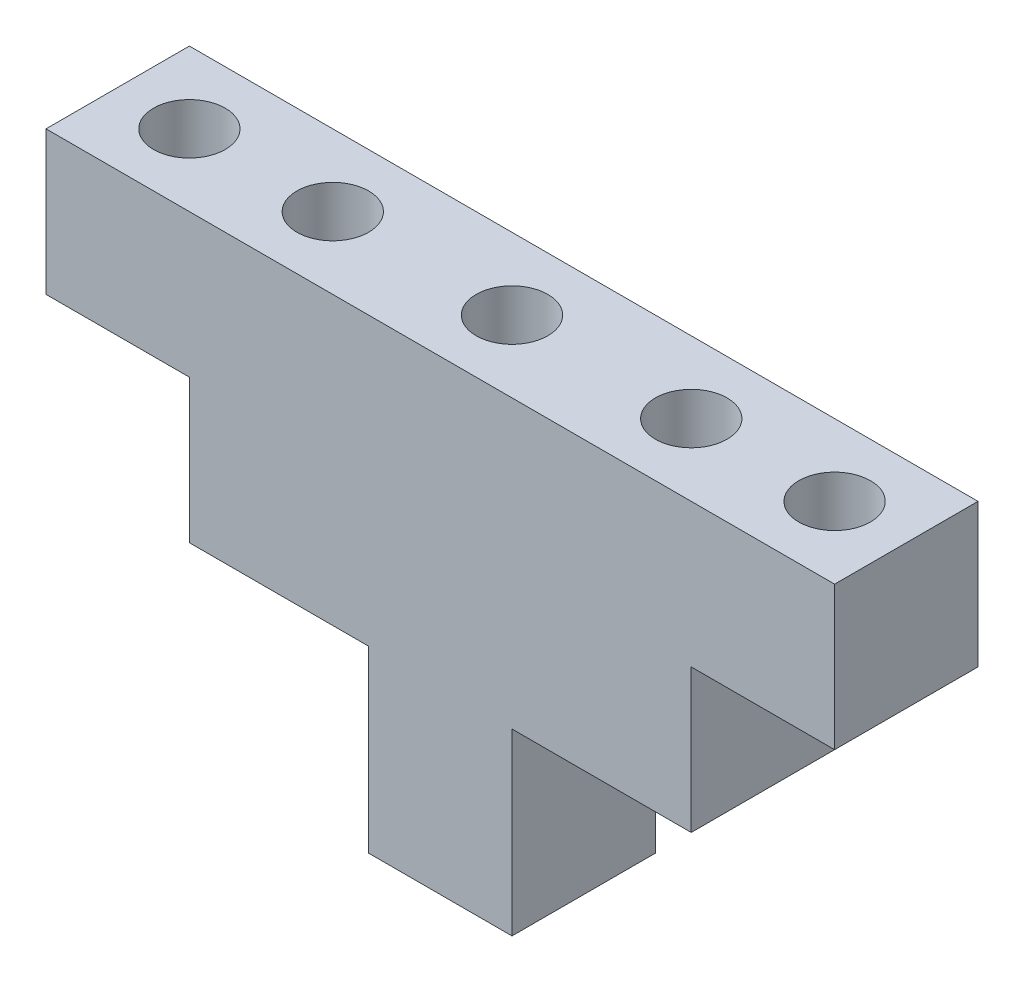
ISO-10303-21;
HEADER;
FILE_DESCRIPTION(('STEP AP214'),'2;1');
FILE_NAME('part.step','',(''),(''),'','','');
FILE_SCHEMA(('AUTOMOTIVE_DESIGN { 1 0 10303 214 1 1 1 1 }'));
ENDSEC;
DATA;
#1=APPLICATION_CONTEXT('core data for automotive mechanical design processes');
#2=APPLICATION_PROTOCOL_DEFINITION('international standard','automotive_design',2000,#1);
#3=PRODUCT_CONTEXT('',#1,'mechanical');
#4=PRODUCT('Part','Part','',(#3));
#5=PRODUCT_RELATED_PRODUCT_CATEGORY('part','',(#4));
#6=PRODUCT_DEFINITION_FORMATION('','',#4);
#7=PRODUCT_DEFINITION_CONTEXT('part definition',#1,'design');
#8=PRODUCT_DEFINITION('design','',#6,#7);
#9=PRODUCT_DEFINITION_SHAPE('','',#8);
#10=(LENGTH_UNIT() NAMED_UNIT(*) SI_UNIT(.MILLI.,.METRE.));
#11=(NAMED_UNIT(*) PLANE_ANGLE_UNIT() SI_UNIT($,.RADIAN.));
#12=(NAMED_UNIT(*) SI_UNIT($,.STERADIAN.) SOLID_ANGLE_UNIT());
#13=UNCERTAINTY_MEASURE_WITH_UNIT(LENGTH_MEASURE(1.E-05),#10,'distance_accuracy_value','');
#14=(GEOMETRIC_REPRESENTATION_CONTEXT(3) GLOBAL_UNCERTAINTY_ASSIGNED_CONTEXT((#13)) GLOBAL_UNIT_ASSIGNED_CONTEXT((#10,
#11,#12)) REPRESENTATION_CONTEXT('',''));
#15=CARTESIAN_POINT('',(0.,0.,0.));
#16=DIRECTION('',(0.,0.,1.));
#17=DIRECTION('',(1.,0.,0.));
#18=AXIS2_PLACEMENT_3D('',#15,#16,#17);
#19=CARTESIAN_POINT('',(0.,0.,12.7));
#20=DIRECTION('',(0.,0.,1.));
#21=DIRECTION('',(1.,0.,0.));
#22=AXIS2_PLACEMENT_3D('',#19,#20,#21);
#23=PLANE('',#22);
#24=DIRECTION('',(0.,1.,0.));
#25=VECTOR('',#24,1.);
#26=CARTESIAN_POINT('',(-6.35,-28.575,12.7));
#27=LINE('',#26,#25);
#28=CARTESIAN_POINT('',(-6.35,-28.575,12.7));
#29=VERTEX_POINT('',#28);
#30=CARTESIAN_POINT('',(-6.35,-12.7,12.7));
#31=VERTEX_POINT('',#30);
#32=EDGE_CURVE('E155',#29,#31,#27,.T.);
#33=ORIENTED_EDGE('',*,*,#32,.F.);
#34=DIRECTION('',(-1.,0.,0.));
#35=VECTOR('',#34,1.);
#36=CARTESIAN_POINT('',(-22.225,-28.575,12.7));
#37=LINE('',#36,#35);
#38=CARTESIAN_POINT('',(6.35,-28.575,12.7));
#39=VERTEX_POINT('',#38);
#40=EDGE_CURVE('E140',#39,#29,#37,.T.);
#41=ORIENTED_EDGE('',*,*,#40,.F.);
#42=DIRECTION('',(0.,1.,0.));
#43=VECTOR('',#42,1.);
#44=CARTESIAN_POINT('',(6.35,-28.575,12.7));
#45=LINE('',#44,#43);
#46=CARTESIAN_POINT('',(6.35,-12.7,12.7));
#47=VERTEX_POINT('',#46);
#48=EDGE_CURVE('E148',#39,#47,#45,.T.);
#49=ORIENTED_EDGE('',*,*,#48,.T.);
#50=DIRECTION('',(1.,0.,0.));
#51=VECTOR('',#50,1.);
#52=CARTESIAN_POINT('',(0.,-12.7,12.7));
#53=LINE('',#52,#51);
#54=CARTESIAN_POINT('',(22.225,-12.7,12.7));
#55=VERTEX_POINT('',#54);
#56=EDGE_CURVE('E63',#47,#55,#53,.T.);
#57=ORIENTED_EDGE('',*,*,#56,.T.);
#58=DIRECTION('',(0.,1.,0.));
#59=VECTOR('',#58,1.);
#60=CARTESIAN_POINT('',(22.225,0.,12.7));
#61=LINE('',#60,#59);
#62=CARTESIAN_POINT('',(22.225,0.,12.7));
#63=VERTEX_POINT('',#62);
#64=EDGE_CURVE('E191',#55,#63,#61,.T.);
#65=ORIENTED_EDGE('',*,*,#64,.T.);
#66=DIRECTION('',(1.,0.,0.));
#67=VECTOR('',#66,1.);
#68=CARTESIAN_POINT('',(0.,0.,12.7));
#69=LINE('',#68,#67);
#70=CARTESIAN_POINT('',(34.925,0.,12.7));
#71=VERTEX_POINT('',#70);
#72=EDGE_CURVE('E194',#63,#71,#69,.T.);
#73=ORIENTED_EDGE('',*,*,#72,.T.);
#74=DIRECTION('',(0.,-1.,0.));
#75=VECTOR('',#74,1.);
#76=CARTESIAN_POINT('',(34.925,0.,12.7));
#77=LINE('',#76,#75);
#78=CARTESIAN_POINT('',(34.925,12.7,12.7));
#79=VERTEX_POINT('',#78);
#80=EDGE_CURVE('E197',#79,#71,#77,.T.);
#81=ORIENTED_EDGE('',*,*,#80,.F.);
#82=DIRECTION('',(1.,0.,0.));
#83=VECTOR('',#82,1.);
#84=CARTESIAN_POINT('',(0.,12.7,12.7));
#85=LINE('',#84,#83);
#86=CARTESIAN_POINT('',(-34.925,12.7,12.7));
#87=VERTEX_POINT('',#86);
#88=EDGE_CURVE('E200',#87,#79,#85,.T.);
#89=ORIENTED_EDGE('',*,*,#88,.F.);
#90=DIRECTION('',(0.,-1.,0.));
#91=VECTOR('',#90,1.);
#92=CARTESIAN_POINT('',(-34.925,0.,12.7));
#93=LINE('',#92,#91);
#94=CARTESIAN_POINT('',(-34.925,0.,12.7));
#95=VERTEX_POINT('',#94);
#96=EDGE_CURVE('E203',#87,#95,#93,.T.);
#97=ORIENTED_EDGE('',*,*,#96,.T.);
#98=DIRECTION('',(1.,0.,0.));
#99=VECTOR('',#98,1.);
#100=CARTESIAN_POINT('',(0.,0.,12.7));
#101=LINE('',#100,#99);
#102=CARTESIAN_POINT('',(-22.225,0.,12.7));
#103=VERTEX_POINT('',#102);
#104=EDGE_CURVE('E205',#95,#103,#101,.T.);
#105=ORIENTED_EDGE('',*,*,#104,.T.);
#106=DIRECTION('',(0.,1.,0.));
#107=VECTOR('',#106,1.);
#108=CARTESIAN_POINT('',(-22.225,0.,12.7));
#109=LINE('',#108,#107);
#110=CARTESIAN_POINT('',(-22.225,-12.7,12.7));
#111=VERTEX_POINT('',#110);
#112=EDGE_CURVE('E207',#111,#103,#109,.T.);
#113=ORIENTED_EDGE('',*,*,#112,.F.);
#114=EDGE_CURVE('E210',#111,#31,#53,.T.);
#115=ORIENTED_EDGE('',*,*,#114,.T.);
#116=EDGE_LOOP('',(#33,#41,#49,#57,#65,#73,#81,#89,#97,#105,#113,#115));
#117=FACE_BOUND('',#116,.T.);
#118=ADVANCED_FACE('F47',(#117),#23,.T.);
#119=CARTESIAN_POINT('',(0.,0.,0.));
#120=DIRECTION('',(0.,0.,1.));
#121=DIRECTION('',(1.,0.,0.));
#122=AXIS2_PLACEMENT_3D('',#119,#120,#121);
#123=PLANE('',#122);
#124=DIRECTION('',(1.,0.,0.));
#125=VECTOR('',#124,1.);
#126=CARTESIAN_POINT('',(-22.225,-28.575,0.));
#127=LINE('',#126,#125);
#128=CARTESIAN_POINT('',(-6.35,-28.575,0.));
#129=VERTEX_POINT('',#128);
#130=CARTESIAN_POINT('',(6.35,-28.575,0.));
#131=VERTEX_POINT('',#130);
#132=EDGE_CURVE('E143',#129,#131,#127,.T.);
#133=ORIENTED_EDGE('',*,*,#132,.F.);
#134=DIRECTION('',(0.,1.,0.));
#135=VECTOR('',#134,1.);
#136=CARTESIAN_POINT('',(-6.35,-28.575,0.));
#137=LINE('',#136,#135);
#138=CARTESIAN_POINT('',(-6.35,-12.7,0.));
#139=VERTEX_POINT('',#138);
#140=EDGE_CURVE('E161',#129,#139,#137,.T.);
#141=ORIENTED_EDGE('',*,*,#140,.T.);
#142=DIRECTION('',(1.,0.,0.));
#143=VECTOR('',#142,1.);
#144=CARTESIAN_POINT('',(0.,-12.7,0.));
#145=LINE('',#144,#143);
#146=CARTESIAN_POINT('',(-22.225,-12.7,0.));
#147=VERTEX_POINT('',#146);
#148=EDGE_CURVE('E195',#147,#139,#145,.T.);
#149=ORIENTED_EDGE('',*,*,#148,.F.);
#150=DIRECTION('',(0.,1.,0.));
#151=VECTOR('',#150,1.);
#152=CARTESIAN_POINT('',(-22.225,0.,0.));
#153=LINE('',#152,#151);
#154=CARTESIAN_POINT('',(-22.225,0.,0.));
#155=VERTEX_POINT('',#154);
#156=EDGE_CURVE('E229',#147,#155,#153,.T.);
#157=ORIENTED_EDGE('',*,*,#156,.T.);
#158=DIRECTION('',(1.,0.,0.));
#159=VECTOR('',#158,1.);
#160=CARTESIAN_POINT('',(0.,0.,0.));
#161=LINE('',#160,#159);
#162=CARTESIAN_POINT('',(-34.925,0.,0.));
#163=VERTEX_POINT('',#162);
#164=EDGE_CURVE('E226',#163,#155,#161,.T.);
#165=ORIENTED_EDGE('',*,*,#164,.F.);
#166=DIRECTION('',(0.,-1.,0.));
#167=VECTOR('',#166,1.);
#168=CARTESIAN_POINT('',(-34.925,0.,0.));
#169=LINE('',#168,#167);
#170=CARTESIAN_POINT('',(-34.925,12.7,0.));
#171=VERTEX_POINT('',#170);
#172=EDGE_CURVE('E224',#171,#163,#169,.T.);
#173=ORIENTED_EDGE('',*,*,#172,.F.);
#174=DIRECTION('',(1.,0.,0.));
#175=VECTOR('',#174,1.);
#176=CARTESIAN_POINT('',(0.,12.7,0.));
#177=LINE('',#176,#175);
#178=CARTESIAN_POINT('',(34.925,12.7,0.));
#179=VERTEX_POINT('',#178);
#180=EDGE_CURVE('E221',#171,#179,#177,.T.);
#181=ORIENTED_EDGE('',*,*,#180,.T.);
#182=DIRECTION('',(0.,-1.,0.));
#183=VECTOR('',#182,1.);
#184=CARTESIAN_POINT('',(34.925,0.,0.));
#185=LINE('',#184,#183);
#186=CARTESIAN_POINT('',(34.925,0.,0.));
#187=VERTEX_POINT('',#186);
#188=EDGE_CURVE('E218',#179,#187,#185,.T.);
#189=ORIENTED_EDGE('',*,*,#188,.T.);
#190=DIRECTION('',(1.,0.,0.));
#191=VECTOR('',#190,1.);
#192=CARTESIAN_POINT('',(0.,0.,0.));
#193=LINE('',#192,#191);
#194=CARTESIAN_POINT('',(22.225,0.,0.));
#195=VERTEX_POINT('',#194);
#196=EDGE_CURVE('E215',#195,#187,#193,.T.);
#197=ORIENTED_EDGE('',*,*,#196,.F.);
#198=DIRECTION('',(0.,1.,0.));
#199=VECTOR('',#198,1.);
#200=CARTESIAN_POINT('',(22.225,0.,0.));
#201=LINE('',#200,#199);
#202=CARTESIAN_POINT('',(22.225,-12.7,0.));
#203=VERTEX_POINT('',#202);
#204=EDGE_CURVE('E181',#203,#195,#201,.T.);
#205=ORIENTED_EDGE('',*,*,#204,.F.);
#206=CARTESIAN_POINT('',(6.35,-12.7,0.));
#207=VERTEX_POINT('',#206);
#208=EDGE_CURVE('E232',#207,#203,#145,.T.);
#209=ORIENTED_EDGE('',*,*,#208,.F.);
#210=DIRECTION('',(0.,1.,0.));
#211=VECTOR('',#210,1.);
#212=CARTESIAN_POINT('',(6.35,-28.575,0.));
#213=LINE('',#212,#211);
#214=EDGE_CURVE('E159',#131,#207,#213,.T.);
#215=ORIENTED_EDGE('',*,*,#214,.F.);
#216=EDGE_LOOP('',(#133,#141,#149,#157,#165,#173,#181,#189,#197,#205,#209,#215));
#217=FACE_BOUND('',#216,.T.);
#218=ADVANCED_FACE('F257',(#217),#123,.F.);
#219=CARTESIAN_POINT('',(0.,-12.7,12.7));
#220=DIRECTION('',(0.,1.,0.));
#221=DIRECTION('',(0.,0.,1.));
#222=AXIS2_PLACEMENT_3D('',#219,#220,#221);
#223=PLANE('',#222);
#224=CARTESIAN_POINT('',(15.875,-12.7,6.35));
#225=DIRECTION('',(0.,-1.,0.));
#226=DIRECTION('',(0.,0.,-1.));
#227=AXIS2_PLACEMENT_3D('',#224,#225,#226);
#228=CIRCLE('',#227,3.175);
#229=CARTESIAN_POINT('',(15.875,-12.7,3.175));
#230=VERTEX_POINT('',#229);
#231=EDGE_CURVE('E185',#230,#230,#228,.T.);
#232=ORIENTED_EDGE('',*,*,#231,.F.);
#233=EDGE_LOOP('',(#232));
#234=FACE_BOUND('',#233,.T.);
#235=DIRECTION('',(0.,0.,1.));
#236=VECTOR('',#235,1.);
#237=CARTESIAN_POINT('',(6.35,-12.7,0.));
#238=LINE('',#237,#236);
#239=EDGE_CURVE('E158',#207,#47,#238,.T.);
#240=ORIENTED_EDGE('',*,*,#239,.F.);
#241=ORIENTED_EDGE('',*,*,#208,.T.);
#242=DIRECTION('',(0.,0.,-1.));
#243=VECTOR('',#242,1.);
#244=CARTESIAN_POINT('',(22.225,-12.7,12.7));
#245=LINE('',#244,#243);
#246=EDGE_CURVE('E212',#55,#203,#245,.T.);
#247=ORIENTED_EDGE('',*,*,#246,.F.);
#248=ORIENTED_EDGE('',*,*,#56,.F.);
#249=EDGE_LOOP('',(#240,#241,#247,#248));
#250=FACE_BOUND('',#249,.T.);
#251=ADVANCED_FACE('F268',(#234,#250),#223,.F.);
#252=CARTESIAN_POINT('',(-15.875,-12.7,6.35));
#253=DIRECTION('',(0.,-1.,0.));
#254=DIRECTION('',(0.,0.,-1.));
#255=AXIS2_PLACEMENT_3D('',#252,#253,#254);
#256=CIRCLE('',#255,3.175);
#257=CARTESIAN_POINT('',(-15.875,-12.7,3.175));
#258=VERTEX_POINT('',#257);
#259=EDGE_CURVE('E182',#258,#258,#256,.T.);
#260=ORIENTED_EDGE('',*,*,#259,.F.);
#261=EDGE_LOOP('',(#260));
#262=FACE_BOUND('',#261,.T.);
#263=DIRECTION('',(0.,0.,-1.));
#264=VECTOR('',#263,1.);
#265=CARTESIAN_POINT('',(-6.35,-12.7,12.7));
#266=LINE('',#265,#264);
#267=EDGE_CURVE('E71',#31,#139,#266,.T.);
#268=ORIENTED_EDGE('',*,*,#267,.F.);
#269=ORIENTED_EDGE('',*,*,#114,.F.);
#270=DIRECTION('',(0.,0.,-1.));
#271=VECTOR('',#270,1.);
#272=CARTESIAN_POINT('',(-22.225,-12.7,12.7));
#273=LINE('',#272,#271);
#274=EDGE_CURVE('E236',#111,#147,#273,.T.);
#275=ORIENTED_EDGE('',*,*,#274,.T.);
#276=ORIENTED_EDGE('',*,*,#148,.T.);
#277=EDGE_LOOP('',(#268,#269,#275,#276));
#278=FACE_BOUND('',#277,.T.);
#279=ADVANCED_FACE('F307',(#262,#278),#223,.F.);
#280=CARTESIAN_POINT('',(22.225,0.,12.7));
#281=DIRECTION('',(-1.,0.,0.));
#282=DIRECTION('',(0.,0.,1.));
#283=AXIS2_PLACEMENT_3D('',#280,#281,#282);
#284=PLANE('',#283);
#285=ORIENTED_EDGE('',*,*,#204,.T.);
#286=DIRECTION('',(0.,0.,-1.));
#287=VECTOR('',#286,1.);
#288=CARTESIAN_POINT('',(22.225,0.,12.7));
#289=LINE('',#288,#287);
#290=EDGE_CURVE('E11',#63,#195,#289,.T.);
#291=ORIENTED_EDGE('',*,*,#290,.F.);
#292=ORIENTED_EDGE('',*,*,#64,.F.);
#293=ORIENTED_EDGE('',*,*,#246,.T.);
#294=EDGE_LOOP('',(#285,#291,#292,#293));
#295=FACE_BOUND('',#294,.T.);
#296=ADVANCED_FACE('F49',(#295),#284,.F.);
#297=CARTESIAN_POINT('',(0.,0.,12.7));
#298=DIRECTION('',(0.,1.,0.));
#299=DIRECTION('',(0.,0.,1.));
#300=AXIS2_PLACEMENT_3D('',#297,#298,#299);
#301=PLANE('',#300);
#302=CARTESIAN_POINT('',(28.575,0.,6.35));
#303=DIRECTION('',(0.,-1.,0.));
#304=DIRECTION('',(0.,0.,-1.));
#305=AXIS2_PLACEMENT_3D('',#302,#303,#304);
#306=CIRCLE('',#305,3.175);
#307=CARTESIAN_POINT('',(28.575,0.,3.175));
#308=VERTEX_POINT('',#307);
#309=EDGE_CURVE('E169',#308,#308,#306,.T.);
#310=ORIENTED_EDGE('',*,*,#309,.F.);
#311=EDGE_LOOP('',(#310));
#312=FACE_BOUND('',#311,.T.);
#313=ORIENTED_EDGE('',*,*,#196,.T.);
#314=DIRECTION('',(0.,0.,-1.));
#315=VECTOR('',#314,1.);
#316=CARTESIAN_POINT('',(34.925,0.,12.7));
#317=LINE('',#316,#315);
#318=EDGE_CURVE('E56',#71,#187,#317,.T.);
#319=ORIENTED_EDGE('',*,*,#318,.F.);
#320=ORIENTED_EDGE('',*,*,#72,.F.);
#321=ORIENTED_EDGE('',*,*,#290,.T.);
#322=EDGE_LOOP('',(#313,#319,#320,#321));
#323=FACE_BOUND('',#322,.T.);
#324=ADVANCED_FACE('F253',(#312,#323),#301,.F.);
#325=CARTESIAN_POINT('',(34.925,0.,12.7));
#326=DIRECTION('',(1.,0.,0.));
#327=DIRECTION('',(0.,1.,0.));
#328=AXIS2_PLACEMENT_3D('',#325,#326,#327);
#329=PLANE('',#328);
#330=ORIENTED_EDGE('',*,*,#188,.F.);
#331=DIRECTION('',(0.,0.,-1.));
#332=VECTOR('',#331,1.);
#333=CARTESIAN_POINT('',(34.925,12.7,12.7));
#334=LINE('',#333,#332);
#335=EDGE_CURVE('E245',#79,#179,#334,.T.);
#336=ORIENTED_EDGE('',*,*,#335,.F.);
#337=ORIENTED_EDGE('',*,*,#80,.T.);
#338=ORIENTED_EDGE('',*,*,#318,.T.);
#339=EDGE_LOOP('',(#330,#336,#337,#338));
#340=FACE_BOUND('',#339,.T.);
#341=ADVANCED_FACE('F250',(#340),#329,.T.);
#342=CARTESIAN_POINT('',(0.,12.7,12.7));
#343=DIRECTION('',(0.,1.,0.));
#344=DIRECTION('',(0.,0.,1.));
#345=AXIS2_PLACEMENT_3D('',#342,#343,#344);
#346=PLANE('',#345);
#347=CARTESIAN_POINT('',(0.,12.7,6.35));
#348=DIRECTION('',(0.,1.,0.));
#349=DIRECTION('',(0.,0.,1.));
#350=AXIS2_PLACEMENT_3D('',#347,#348,#349);
#351=CIRCLE('',#350,3.175);
#352=CARTESIAN_POINT('',(0.,12.7,9.525));
#353=VERTEX_POINT('',#352);
#354=EDGE_CURVE('E275',#353,#353,#351,.F.);
#355=ORIENTED_EDGE('',*,*,#354,.T.);
#356=EDGE_LOOP('',(#355));
#357=FACE_BOUND('',#356,.T.);
#358=CARTESIAN_POINT('',(-28.575,12.7,6.35));
#359=DIRECTION('',(0.,1.,0.));
#360=DIRECTION('',(0.,0.,1.));
#361=AXIS2_PLACEMENT_3D('',#358,#359,#360);
#362=CIRCLE('',#361,3.175);
#363=CARTESIAN_POINT('',(-28.575,12.7,9.525));
#364=VERTEX_POINT('',#363);
#365=EDGE_CURVE('E173',#364,#364,#362,.T.);
#366=ORIENTED_EDGE('',*,*,#365,.F.);
#367=EDGE_LOOP('',(#366));
#368=FACE_BOUND('',#367,.T.);
#369=CARTESIAN_POINT('',(28.575,12.7,6.35));
#370=DIRECTION('',(0.,1.,0.));
#371=DIRECTION('',(0.,0.,1.));
#372=AXIS2_PLACEMENT_3D('',#369,#370,#371);
#373=CIRCLE('',#372,3.175);
#374=CARTESIAN_POINT('',(28.575,12.7,9.525));
#375=VERTEX_POINT('',#374);
#376=EDGE_CURVE('E51',#375,#375,#373,.T.);
#377=ORIENTED_EDGE('',*,*,#376,.F.);
#378=EDGE_LOOP('',(#377));
#379=FACE_BOUND('',#378,.T.);
#380=CARTESIAN_POINT('',(-15.875,12.7,6.35));
#381=DIRECTION('',(0.,-1.,0.));
#382=DIRECTION('',(0.,0.,-1.));
#383=AXIS2_PLACEMENT_3D('',#380,#381,#382);
#384=CIRCLE('',#383,3.175);
#385=CARTESIAN_POINT('',(-15.875,12.7,3.175));
#386=VERTEX_POINT('',#385);
#387=EDGE_CURVE('E178',#386,#386,#384,.T.);
#388=ORIENTED_EDGE('',*,*,#387,.T.);
#389=EDGE_LOOP('',(#388));
#390=FACE_BOUND('',#389,.T.);
#391=CARTESIAN_POINT('',(15.875,12.7,6.35));
#392=DIRECTION('',(0.,-1.,0.));
#393=DIRECTION('',(0.,0.,-1.));
#394=AXIS2_PLACEMENT_3D('',#391,#392,#393);
#395=CIRCLE('',#394,3.175);
#396=CARTESIAN_POINT('',(15.875,12.7,3.175));
#397=VERTEX_POINT('',#396);
#398=EDGE_CURVE('E188',#397,#397,#395,.T.);
#399=ORIENTED_EDGE('',*,*,#398,.T.);
#400=EDGE_LOOP('',(#399));
#401=FACE_BOUND('',#400,.T.);
#402=ORIENTED_EDGE('',*,*,#180,.F.);
#403=DIRECTION('',(0.,0.,-1.));
#404=VECTOR('',#403,1.);
#405=CARTESIAN_POINT('',(-34.925,12.7,12.7));
#406=LINE('',#405,#404);
#407=EDGE_CURVE('E243',#87,#171,#406,.T.);
#408=ORIENTED_EDGE('',*,*,#407,.F.);
#409=ORIENTED_EDGE('',*,*,#88,.T.);
#410=ORIENTED_EDGE('',*,*,#335,.T.);
#411=EDGE_LOOP('',(#402,#408,#409,#410));
#412=FACE_BOUND('',#411,.T.);
#413=ADVANCED_FACE('F262',(#357,#368,#379,#390,#401,#412),#346,.T.);
#414=CARTESIAN_POINT('',(-34.925,0.,12.7));
#415=DIRECTION('',(1.,0.,0.));
#416=DIRECTION('',(0.,0.,-1.));
#417=AXIS2_PLACEMENT_3D('',#414,#415,#416);
#418=PLANE('',#417);
#419=ORIENTED_EDGE('',*,*,#172,.T.);
#420=DIRECTION('',(0.,0.,-1.));
#421=VECTOR('',#420,1.);
#422=CARTESIAN_POINT('',(-34.925,0.,12.7));
#423=LINE('',#422,#421);
#424=EDGE_CURVE('E240',#95,#163,#423,.T.);
#425=ORIENTED_EDGE('',*,*,#424,.F.);
#426=ORIENTED_EDGE('',*,*,#96,.F.);
#427=ORIENTED_EDGE('',*,*,#407,.T.);
#428=EDGE_LOOP('',(#419,#425,#426,#427));
#429=FACE_BOUND('',#428,.T.);
#430=ADVANCED_FACE('F316',(#429),#418,.F.);
#431=CARTESIAN_POINT('',(0.,0.,12.7));
#432=DIRECTION('',(0.,1.,0.));
#433=DIRECTION('',(0.,0.,1.));
#434=AXIS2_PLACEMENT_3D('',#431,#432,#433);
#435=PLANE('',#434);
#436=CARTESIAN_POINT('',(-28.575,0.,6.35));
#437=DIRECTION('',(0.,-1.,0.));
#438=DIRECTION('',(0.,0.,-1.));
#439=AXIS2_PLACEMENT_3D('',#436,#437,#438);
#440=CIRCLE('',#439,3.175);
#441=CARTESIAN_POINT('',(-28.575,0.,3.175));
#442=VERTEX_POINT('',#441);
#443=EDGE_CURVE('E170',#442,#442,#440,.T.);
#444=ORIENTED_EDGE('',*,*,#443,.F.);
#445=EDGE_LOOP('',(#444));
#446=FACE_BOUND('',#445,.T.);
#447=ORIENTED_EDGE('',*,*,#164,.T.);
#448=DIRECTION('',(0.,0.,-1.));
#449=VECTOR('',#448,1.);
#450=CARTESIAN_POINT('',(-22.225,0.,12.7));
#451=LINE('',#450,#449);
#452=EDGE_CURVE('E238',#103,#155,#451,.T.);
#453=ORIENTED_EDGE('',*,*,#452,.F.);
#454=ORIENTED_EDGE('',*,*,#104,.F.);
#455=ORIENTED_EDGE('',*,*,#424,.T.);
#456=EDGE_LOOP('',(#447,#453,#454,#455));
#457=FACE_BOUND('',#456,.T.);
#458=ADVANCED_FACE('F312',(#446,#457),#435,.F.);
#459=CARTESIAN_POINT('',(-22.225,0.,12.7));
#460=DIRECTION('',(-1.,0.,0.));
#461=DIRECTION('',(0.,0.,1.));
#462=AXIS2_PLACEMENT_3D('',#459,#460,#461);
#463=PLANE('',#462);
#464=ORIENTED_EDGE('',*,*,#156,.F.);
#465=ORIENTED_EDGE('',*,*,#274,.F.);
#466=ORIENTED_EDGE('',*,*,#112,.T.);
#467=ORIENTED_EDGE('',*,*,#452,.T.);
#468=EDGE_LOOP('',(#464,#465,#466,#467));
#469=FACE_BOUND('',#468,.T.);
#470=ADVANCED_FACE('F309',(#469),#463,.T.);
#471=CARTESIAN_POINT('',(15.875,12.7,6.35));
#472=DIRECTION('',(0.,-1.,0.));
#473=DIRECTION('',(0.,0.,-1.));
#474=AXIS2_PLACEMENT_3D('',#471,#472,#473);
#475=CYLINDRICAL_SURFACE('',#474,3.175);
#476=ORIENTED_EDGE('',*,*,#398,.F.);
#477=EDGE_LOOP('',(#476));
#478=FACE_BOUND('',#477,.T.);
#479=ORIENTED_EDGE('',*,*,#231,.T.);
#480=EDGE_LOOP('',(#479));
#481=FACE_BOUND('',#480,.T.);
#482=ADVANCED_FACE('F302',(#478,#481),#475,.F.);
#483=CARTESIAN_POINT('',(-15.875,12.7,6.35));
#484=DIRECTION('',(0.,-1.,0.));
#485=DIRECTION('',(0.,0.,-1.));
#486=AXIS2_PLACEMENT_3D('',#483,#484,#485);
#487=CYLINDRICAL_SURFACE('',#486,3.175);
#488=ORIENTED_EDGE('',*,*,#387,.F.);
#489=EDGE_LOOP('',(#488));
#490=FACE_BOUND('',#489,.T.);
#491=ORIENTED_EDGE('',*,*,#259,.T.);
#492=EDGE_LOOP('',(#491));
#493=FACE_BOUND('',#492,.T.);
#494=ADVANCED_FACE('F343',(#490,#493),#487,.F.);
#495=CARTESIAN_POINT('',(-28.575,25.4,6.35));
#496=DIRECTION('',(0.,-1.,0.));
#497=DIRECTION('',(0.,0.,-1.));
#498=AXIS2_PLACEMENT_3D('',#495,#496,#497);
#499=CYLINDRICAL_SURFACE('',#498,3.175);
#500=ORIENTED_EDGE('',*,*,#365,.T.);
#501=EDGE_LOOP('',(#500));
#502=FACE_BOUND('',#501,.T.);
#503=ORIENTED_EDGE('',*,*,#443,.T.);
#504=EDGE_LOOP('',(#503));
#505=FACE_BOUND('',#504,.T.);
#506=ADVANCED_FACE('F334',(#502,#505),#499,.F.);
#507=CARTESIAN_POINT('',(28.575,25.4,6.35));
#508=DIRECTION('',(0.,-1.,0.));
#509=DIRECTION('',(0.,0.,-1.));
#510=AXIS2_PLACEMENT_3D('',#507,#508,#509);
#511=CYLINDRICAL_SURFACE('',#510,3.175);
#512=ORIENTED_EDGE('',*,*,#376,.T.);
#513=EDGE_LOOP('',(#512));
#514=FACE_BOUND('',#513,.T.);
#515=ORIENTED_EDGE('',*,*,#309,.T.);
#516=EDGE_LOOP('',(#515));
#517=FACE_BOUND('',#516,.T.);
#518=ADVANCED_FACE('F332',(#514,#517),#511,.F.);
#519=CARTESIAN_POINT('',(-6.35,-28.575,12.7));
#520=DIRECTION('',(1.,0.,0.));
#521=DIRECTION('',(0.,0.,-1.));
#522=AXIS2_PLACEMENT_3D('',#519,#520,#521);
#523=PLANE('',#522);
#524=ORIENTED_EDGE('',*,*,#267,.T.);
#525=ORIENTED_EDGE('',*,*,#140,.F.);
#526=DIRECTION('',(0.,0.,-1.));
#527=VECTOR('',#526,1.);
#528=CARTESIAN_POINT('',(-6.35,-28.575,12.7));
#529=LINE('',#528,#527);
#530=EDGE_CURVE('E149',#29,#129,#529,.T.);
#531=ORIENTED_EDGE('',*,*,#530,.F.);
#532=ORIENTED_EDGE('',*,*,#32,.T.);
#533=EDGE_LOOP('',(#524,#525,#531,#532));
#534=FACE_BOUND('',#533,.T.);
#535=ADVANCED_FACE('F291',(#534),#523,.F.);
#536=CARTESIAN_POINT('',(6.35,-28.575,0.));
#537=DIRECTION('',(-1.,0.,0.));
#538=DIRECTION('',(0.,0.,1.));
#539=AXIS2_PLACEMENT_3D('',#536,#537,#538);
#540=PLANE('',#539);
#541=ORIENTED_EDGE('',*,*,#239,.T.);
#542=ORIENTED_EDGE('',*,*,#48,.F.);
#543=DIRECTION('',(0.,0.,1.));
#544=VECTOR('',#543,1.);
#545=CARTESIAN_POINT('',(6.35,-28.575,0.));
#546=LINE('',#545,#544);
#547=EDGE_CURVE('E137',#131,#39,#546,.T.);
#548=ORIENTED_EDGE('',*,*,#547,.F.);
#549=ORIENTED_EDGE('',*,*,#214,.T.);
#550=EDGE_LOOP('',(#541,#542,#548,#549));
#551=FACE_BOUND('',#550,.T.);
#552=ADVANCED_FACE('F157',(#551),#540,.F.);
#553=CARTESIAN_POINT('',(0.,-28.575,0.));
#554=DIRECTION('',(0.,-1.,0.));
#555=DIRECTION('',(0.,0.,-1.));
#556=AXIS2_PLACEMENT_3D('',#553,#554,#555);
#557=PLANE('',#556);
#558=CARTESIAN_POINT('',(0.,-28.575,6.35));
#559=DIRECTION('',(0.,-1.,0.));
#560=DIRECTION('',(0.,0.,-1.));
#561=AXIS2_PLACEMENT_3D('',#558,#559,#560);
#562=CIRCLE('',#561,3.175);
#563=CARTESIAN_POINT('',(0.,-28.575,3.175));
#564=VERTEX_POINT('',#563);
#565=EDGE_CURVE('E274',#564,#564,#562,.T.);
#566=ORIENTED_EDGE('',*,*,#565,.F.);
#567=EDGE_LOOP('',(#566));
#568=FACE_BOUND('',#567,.T.);
#569=ORIENTED_EDGE('',*,*,#530,.T.);
#570=ORIENTED_EDGE('',*,*,#132,.T.);
#571=ORIENTED_EDGE('',*,*,#547,.T.);
#572=ORIENTED_EDGE('',*,*,#40,.T.);
#573=EDGE_LOOP('',(#569,#570,#571,#572));
#574=FACE_BOUND('',#573,.T.);
#575=ADVANCED_FACE('F139',(#568,#574),#557,.T.);
#576=CARTESIAN_POINT('',(0.,12.701,6.35));
#577=DIRECTION('',(0.,-1.,0.));
#578=DIRECTION('',(0.,0.,-1.));
#579=AXIS2_PLACEMENT_3D('',#576,#577,#578);
#580=CYLINDRICAL_SURFACE('',#579,3.175);
#581=ORIENTED_EDGE('',*,*,#354,.F.);
#582=EDGE_LOOP('',(#581));
#583=FACE_BOUND('',#582,.T.);
#584=ORIENTED_EDGE('',*,*,#565,.T.);
#585=EDGE_LOOP('',(#584));
#586=FACE_BOUND('',#585,.T.);
#587=ADVANCED_FACE('F281',(#583,#586),#580,.F.);
#588=CLOSED_SHELL('',(#118,#218,#251,#279,#296,#324,#341,#413,#430,#458,#470,#482,#494,#506,
#518,#535,#552,#575,#587));
#589=MANIFOLD_SOLID_BREP('B2',#588);
#590=ADVANCED_BREP_SHAPE_REPRESENTATION('',(#18,#589),#14);
#591=SHAPE_DEFINITION_REPRESENTATION(#9,#590);
ENDSEC;
END-ISO-10303-21;
